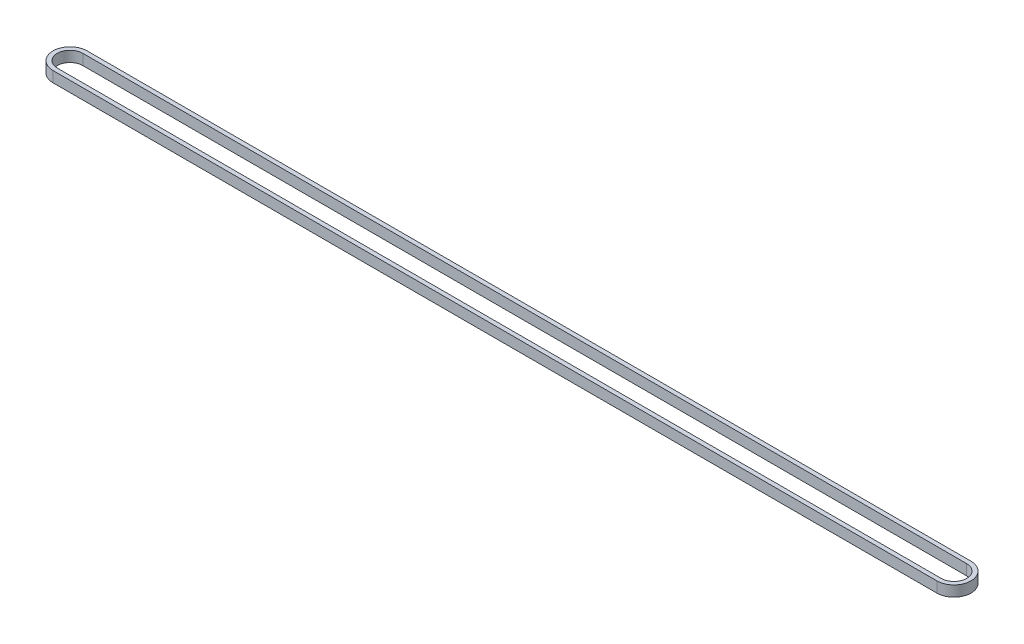
ISO-10303-21;
HEADER;
FILE_DESCRIPTION(('STEP AP214'),'2;1');
FILE_NAME('part.step','',(''),(''),'','','');
FILE_SCHEMA(('AUTOMOTIVE_DESIGN { 1 0 10303 214 1 1 1 1 }'));
ENDSEC;
DATA;
#1=APPLICATION_CONTEXT('core data for automotive mechanical design processes');
#2=APPLICATION_PROTOCOL_DEFINITION('international standard','automotive_design',2000,#1);
#3=PRODUCT_CONTEXT('',#1,'mechanical');
#4=PRODUCT('Part','Part','',(#3));
#5=PRODUCT_RELATED_PRODUCT_CATEGORY('part','',(#4));
#6=PRODUCT_DEFINITION_FORMATION('','',#4);
#7=PRODUCT_DEFINITION_CONTEXT('part definition',#1,'design');
#8=PRODUCT_DEFINITION('design','',#6,#7);
#9=PRODUCT_DEFINITION_SHAPE('','',#8);
#10=(LENGTH_UNIT() NAMED_UNIT(*) SI_UNIT(.MILLI.,.METRE.));
#11=(NAMED_UNIT(*) PLANE_ANGLE_UNIT() SI_UNIT($,.RADIAN.));
#12=(NAMED_UNIT(*) SI_UNIT($,.STERADIAN.) SOLID_ANGLE_UNIT());
#13=UNCERTAINTY_MEASURE_WITH_UNIT(LENGTH_MEASURE(1.E-05),#10,'distance_accuracy_value','');
#14=(GEOMETRIC_REPRESENTATION_CONTEXT(3) GLOBAL_UNCERTAINTY_ASSIGNED_CONTEXT((#13)) GLOBAL_UNIT_ASSIGNED_CONTEXT((#10,
#11,#12)) REPRESENTATION_CONTEXT('',''));
#15=CARTESIAN_POINT('',(0.,0.,0.));
#16=DIRECTION('',(0.,0.,1.));
#17=DIRECTION('',(1.,0.,0.));
#18=AXIS2_PLACEMENT_3D('',#15,#16,#17);
#19=CARTESIAN_POINT('',(39.267874125526,5.,-65.0224656768684));
#20=DIRECTION('',(0.,1.,0.));
#21=DIRECTION('',(0.,0.,1.));
#22=AXIS2_PLACEMENT_3D('',#19,#20,#21);
#23=PLANE('',#22);
#24=CARTESIAN_POINT('',(39.267874125526,5.,-65.0224656768684));
#25=DIRECTION('',(0.,1.,0.));
#26=DIRECTION('',(0.,0.,1.));
#27=AXIS2_PLACEMENT_3D('',#24,#25,#26);
#28=CIRCLE('',#27,8.);
#29=CARTESIAN_POINT('',(39.267874125526,5.,-73.0224656768684));
#30=VERTEX_POINT('',#29);
#31=CARTESIAN_POINT('',(39.267874125526,5.,-57.0224656768684));
#32=VERTEX_POINT('',#31);
#33=EDGE_CURVE('E152',#30,#32,#28,.T.);
#34=ORIENTED_EDGE('',*,*,#33,.T.);
#35=DIRECTION('',(1.,0.,0.));
#36=VECTOR('',#35,1.);
#37=CARTESIAN_POINT('',(39.267874125526,5.,-57.0224656768684));
#38=LINE('',#37,#36);
#39=CARTESIAN_POINT('',(454.267874125526,5.,-57.0224656768684));
#40=VERTEX_POINT('',#39);
#41=EDGE_CURVE('E156',#32,#40,#38,.T.);
#42=ORIENTED_EDGE('',*,*,#41,.T.);
#43=CARTESIAN_POINT('',(454.267874125526,5.,-65.0224656768684));
#44=DIRECTION('',(0.,1.,0.));
#45=DIRECTION('',(0.,0.,1.));
#46=AXIS2_PLACEMENT_3D('',#43,#44,#45);
#47=CIRCLE('',#46,8.);
#48=CARTESIAN_POINT('',(454.267874125526,5.,-73.0224656768684));
#49=VERTEX_POINT('',#48);
#50=EDGE_CURVE('E160',#40,#49,#47,.T.);
#51=ORIENTED_EDGE('',*,*,#50,.T.);
#52=DIRECTION('',(-1.,0.,0.));
#53=VECTOR('',#52,1.);
#54=CARTESIAN_POINT('',(39.267874125526,5.,-73.0224656768684));
#55=LINE('',#54,#53);
#56=EDGE_CURVE('E162',#49,#30,#55,.T.);
#57=ORIENTED_EDGE('',*,*,#56,.T.);
#58=EDGE_LOOP('',(#34,#42,#51,#57));
#59=FACE_BOUND('',#58,.T.);
#60=DIRECTION('',(1.,0.,0.));
#61=VECTOR('',#60,1.);
#62=CARTESIAN_POINT('',(39.267874125526,5.,-59.0224656768684));
#63=LINE('',#62,#61);
#64=CARTESIAN_POINT('',(39.267874125526,5.,-59.0224656768684));
#65=VERTEX_POINT('',#64);
#66=CARTESIAN_POINT('',(454.267874125526,5.,-59.0224656768684));
#67=VERTEX_POINT('',#66);
#68=EDGE_CURVE('E111',#65,#67,#63,.T.);
#69=ORIENTED_EDGE('',*,*,#68,.F.);
#70=CARTESIAN_POINT('',(39.267874125526,5.,-65.0224656768684));
#71=DIRECTION('',(0.,1.,0.));
#72=DIRECTION('',(0.,0.,1.));
#73=AXIS2_PLACEMENT_3D('',#70,#71,#72);
#74=CIRCLE('',#73,6.);
#75=CARTESIAN_POINT('',(39.267874125526,5.,-71.0224656768684));
#76=VERTEX_POINT('',#75);
#77=EDGE_CURVE('E102',#76,#65,#74,.T.);
#78=ORIENTED_EDGE('',*,*,#77,.F.);
#79=DIRECTION('',(-1.,0.,0.));
#80=VECTOR('',#79,1.);
#81=CARTESIAN_POINT('',(39.267874125526,5.,-71.0224656768684));
#82=LINE('',#81,#80);
#83=CARTESIAN_POINT('',(454.267874125526,5.,-71.0224656768684));
#84=VERTEX_POINT('',#83);
#85=EDGE_CURVE('E130',#84,#76,#82,.T.);
#86=ORIENTED_EDGE('',*,*,#85,.F.);
#87=CARTESIAN_POINT('',(454.267874125526,5.,-65.0224656768684));
#88=DIRECTION('',(0.,1.,0.));
#89=DIRECTION('',(0.,0.,1.));
#90=AXIS2_PLACEMENT_3D('',#87,#88,#89);
#91=CIRCLE('',#90,6.00000000000002);
#92=EDGE_CURVE('E124',#67,#84,#91,.T.);
#93=ORIENTED_EDGE('',*,*,#92,.F.);
#94=EDGE_LOOP('',(#69,#78,#86,#93));
#95=FACE_BOUND('',#94,.T.);
#96=ADVANCED_FACE('F36',(#59,#95),#23,.T.);
#97=CARTESIAN_POINT('',(39.267874125526,0.,-65.0224656768684));
#98=DIRECTION('',(0.,1.,0.));
#99=DIRECTION('',(0.,0.,1.));
#100=AXIS2_PLACEMENT_3D('',#97,#98,#99);
#101=PLANE('',#100);
#102=CARTESIAN_POINT('',(39.267874125526,0.,-65.0224656768684));
#103=DIRECTION('',(0.,1.,0.));
#104=DIRECTION('',(0.,0.,1.));
#105=AXIS2_PLACEMENT_3D('',#102,#103,#104);
#106=CIRCLE('',#105,8.);
#107=CARTESIAN_POINT('',(39.267874125526,0.,-73.0224656768684));
#108=VERTEX_POINT('',#107);
#109=CARTESIAN_POINT('',(39.267874125526,0.,-57.0224656768684));
#110=VERTEX_POINT('',#109);
#111=EDGE_CURVE('E120',#108,#110,#106,.T.);
#112=ORIENTED_EDGE('',*,*,#111,.F.);
#113=DIRECTION('',(-1.,0.,0.));
#114=VECTOR('',#113,1.);
#115=CARTESIAN_POINT('',(39.267874125526,0.,-73.0224656768684));
#116=LINE('',#115,#114);
#117=CARTESIAN_POINT('',(454.267874125526,0.,-73.0224656768684));
#118=VERTEX_POINT('',#117);
#119=EDGE_CURVE('E157',#118,#108,#116,.T.);
#120=ORIENTED_EDGE('',*,*,#119,.F.);
#121=CARTESIAN_POINT('',(454.267874125526,0.,-65.0224656768684));
#122=DIRECTION('',(0.,1.,0.));
#123=DIRECTION('',(0.,0.,1.));
#124=AXIS2_PLACEMENT_3D('',#121,#122,#123);
#125=CIRCLE('',#124,8.);
#126=CARTESIAN_POINT('',(454.267874125526,0.,-57.0224656768684));
#127=VERTEX_POINT('',#126);
#128=EDGE_CURVE('E172',#127,#118,#125,.T.);
#129=ORIENTED_EDGE('',*,*,#128,.F.);
#130=DIRECTION('',(1.,0.,0.));
#131=VECTOR('',#130,1.);
#132=CARTESIAN_POINT('',(39.267874125526,0.,-57.0224656768684));
#133=LINE('',#132,#131);
#134=EDGE_CURVE('E169',#110,#127,#133,.T.);
#135=ORIENTED_EDGE('',*,*,#134,.F.);
#136=EDGE_LOOP('',(#112,#120,#129,#135));
#137=FACE_BOUND('',#136,.T.);
#138=CARTESIAN_POINT('',(39.267874125526,0.,-65.0224656768684));
#139=DIRECTION('',(0.,1.,0.));
#140=DIRECTION('',(0.,0.,1.));
#141=AXIS2_PLACEMENT_3D('',#138,#139,#140);
#142=CIRCLE('',#141,6.);
#143=CARTESIAN_POINT('',(39.267874125526,0.,-71.0224656768684));
#144=VERTEX_POINT('',#143);
#145=CARTESIAN_POINT('',(39.267874125526,0.,-59.0224656768684));
#146=VERTEX_POINT('',#145);
#147=EDGE_CURVE('E60',#144,#146,#142,.T.);
#148=ORIENTED_EDGE('',*,*,#147,.T.);
#149=DIRECTION('',(1.,0.,0.));
#150=VECTOR('',#149,1.);
#151=CARTESIAN_POINT('',(39.267874125526,0.,-59.0224656768684));
#152=LINE('',#151,#150);
#153=CARTESIAN_POINT('',(454.267874125526,0.,-59.0224656768684));
#154=VERTEX_POINT('',#153);
#155=EDGE_CURVE('E118',#146,#154,#152,.T.);
#156=ORIENTED_EDGE('',*,*,#155,.T.);
#157=CARTESIAN_POINT('',(454.267874125526,0.,-65.0224656768684));
#158=DIRECTION('',(0.,1.,0.));
#159=DIRECTION('',(0.,0.,1.));
#160=AXIS2_PLACEMENT_3D('',#157,#158,#159);
#161=CIRCLE('',#160,6.00000000000002);
#162=CARTESIAN_POINT('',(454.267874125526,0.,-71.0224656768684));
#163=VERTEX_POINT('',#162);
#164=EDGE_CURVE('E139',#154,#163,#161,.T.);
#165=ORIENTED_EDGE('',*,*,#164,.T.);
#166=DIRECTION('',(-1.,0.,0.));
#167=VECTOR('',#166,1.);
#168=CARTESIAN_POINT('',(39.267874125526,0.,-71.0224656768684));
#169=LINE('',#168,#167);
#170=EDGE_CURVE('E112',#163,#144,#169,.T.);
#171=ORIENTED_EDGE('',*,*,#170,.T.);
#172=EDGE_LOOP('',(#148,#156,#165,#171));
#173=FACE_BOUND('',#172,.T.);
#174=ADVANCED_FACE('F194',(#137,#173),#101,.F.);
#175=CARTESIAN_POINT('',(39.267874125526,5.,-65.0224656768684));
#176=DIRECTION('',(0.,-1.,0.));
#177=DIRECTION('',(0.,0.,-1.));
#178=AXIS2_PLACEMENT_3D('',#175,#176,#177);
#179=CYLINDRICAL_SURFACE('',#178,8.);
#180=ORIENTED_EDGE('',*,*,#111,.T.);
#181=DIRECTION('',(0.,-1.,0.));
#182=VECTOR('',#181,1.);
#183=CARTESIAN_POINT('',(39.267874125526,5.,-57.0224656768684));
#184=LINE('',#183,#182);
#185=EDGE_CURVE('E11',#32,#110,#184,.T.);
#186=ORIENTED_EDGE('',*,*,#185,.F.);
#187=ORIENTED_EDGE('',*,*,#33,.F.);
#188=DIRECTION('',(0.,-1.,0.));
#189=VECTOR('',#188,1.);
#190=CARTESIAN_POINT('',(39.267874125526,5.,-73.0224656768684));
#191=LINE('',#190,#189);
#192=EDGE_CURVE('E165',#30,#108,#191,.T.);
#193=ORIENTED_EDGE('',*,*,#192,.T.);
#194=EDGE_LOOP('',(#180,#186,#187,#193));
#195=FACE_BOUND('',#194,.T.);
#196=ADVANCED_FACE('F38',(#195),#179,.T.);
#197=CARTESIAN_POINT('',(39.267874125526,5.,-57.0224656768684));
#198=DIRECTION('',(0.,0.,-1.));
#199=DIRECTION('',(-1.,0.,0.));
#200=AXIS2_PLACEMENT_3D('',#197,#198,#199);
#201=PLANE('',#200);
#202=ORIENTED_EDGE('',*,*,#134,.T.);
#203=DIRECTION('',(0.,-1.,0.));
#204=VECTOR('',#203,1.);
#205=CARTESIAN_POINT('',(454.267874125526,5.,-57.0224656768684));
#206=LINE('',#205,#204);
#207=EDGE_CURVE('E45',#40,#127,#206,.T.);
#208=ORIENTED_EDGE('',*,*,#207,.F.);
#209=ORIENTED_EDGE('',*,*,#41,.F.);
#210=ORIENTED_EDGE('',*,*,#185,.T.);
#211=EDGE_LOOP('',(#202,#208,#209,#210));
#212=FACE_BOUND('',#211,.T.);
#213=ADVANCED_FACE('F204',(#212),#201,.F.);
#214=CARTESIAN_POINT('',(454.267874125526,5.,-65.0224656768684));
#215=DIRECTION('',(0.,-1.,0.));
#216=DIRECTION('',(0.,0.,-1.));
#217=AXIS2_PLACEMENT_3D('',#214,#215,#216);
#218=CYLINDRICAL_SURFACE('',#217,8.);
#219=ORIENTED_EDGE('',*,*,#128,.T.);
#220=DIRECTION('',(0.,-1.,0.));
#221=VECTOR('',#220,1.);
#222=CARTESIAN_POINT('',(454.267874125526,5.,-73.0224656768684));
#223=LINE('',#222,#221);
#224=EDGE_CURVE('E180',#49,#118,#223,.T.);
#225=ORIENTED_EDGE('',*,*,#224,.F.);
#226=ORIENTED_EDGE('',*,*,#50,.F.);
#227=ORIENTED_EDGE('',*,*,#207,.T.);
#228=EDGE_LOOP('',(#219,#225,#226,#227));
#229=FACE_BOUND('',#228,.T.);
#230=ADVANCED_FACE('F188',(#229),#218,.T.);
#231=CARTESIAN_POINT('',(39.267874125526,5.,-73.0224656768684));
#232=DIRECTION('',(0.,0.,1.));
#233=DIRECTION('',(1.,0.,0.));
#234=AXIS2_PLACEMENT_3D('',#231,#232,#233);
#235=PLANE('',#234);
#236=ORIENTED_EDGE('',*,*,#119,.T.);
#237=ORIENTED_EDGE('',*,*,#192,.F.);
#238=ORIENTED_EDGE('',*,*,#56,.F.);
#239=ORIENTED_EDGE('',*,*,#224,.T.);
#240=EDGE_LOOP('',(#236,#237,#238,#239));
#241=FACE_BOUND('',#240,.T.);
#242=ADVANCED_FACE('F198',(#241),#235,.F.);
#243=CARTESIAN_POINT('',(39.267874125526,5.,-65.0224656768684));
#244=DIRECTION('',(0.,-1.,0.));
#245=DIRECTION('',(0.,0.,-1.));
#246=AXIS2_PLACEMENT_3D('',#243,#244,#245);
#247=CYLINDRICAL_SURFACE('',#246,6.);
#248=ORIENTED_EDGE('',*,*,#147,.F.);
#249=DIRECTION('',(0.,-1.,0.));
#250=VECTOR('',#249,1.);
#251=CARTESIAN_POINT('',(39.267874125526,5.,-71.0224656768684));
#252=LINE('',#251,#250);
#253=EDGE_CURVE('E106',#76,#144,#252,.T.);
#254=ORIENTED_EDGE('',*,*,#253,.F.);
#255=ORIENTED_EDGE('',*,*,#77,.T.);
#256=DIRECTION('',(0.,-1.,0.));
#257=VECTOR('',#256,1.);
#258=CARTESIAN_POINT('',(39.267874125526,5.,-59.0224656768684));
#259=LINE('',#258,#257);
#260=EDGE_CURVE('E105',#65,#146,#259,.T.);
#261=ORIENTED_EDGE('',*,*,#260,.T.);
#262=EDGE_LOOP('',(#248,#254,#255,#261));
#263=FACE_BOUND('',#262,.T.);
#264=ADVANCED_FACE('F104',(#263),#247,.F.);
#265=CARTESIAN_POINT('',(39.267874125526,5.,-59.0224656768684));
#266=DIRECTION('',(0.,0.,-1.));
#267=DIRECTION('',(-1.,0.,0.));
#268=AXIS2_PLACEMENT_3D('',#265,#266,#267);
#269=PLANE('',#268);
#270=ORIENTED_EDGE('',*,*,#155,.F.);
#271=ORIENTED_EDGE('',*,*,#260,.F.);
#272=ORIENTED_EDGE('',*,*,#68,.T.);
#273=DIRECTION('',(0.,-1.,0.));
#274=VECTOR('',#273,1.);
#275=CARTESIAN_POINT('',(454.267874125526,5.,-59.0224656768684));
#276=LINE('',#275,#274);
#277=EDGE_CURVE('E121',#67,#154,#276,.T.);
#278=ORIENTED_EDGE('',*,*,#277,.T.);
#279=EDGE_LOOP('',(#270,#271,#272,#278));
#280=FACE_BOUND('',#279,.T.);
#281=ADVANCED_FACE('F115',(#280),#269,.T.);
#282=CARTESIAN_POINT('',(454.267874125526,5.,-65.0224656768684));
#283=DIRECTION('',(0.,-1.,0.));
#284=DIRECTION('',(0.,0.,-1.));
#285=AXIS2_PLACEMENT_3D('',#282,#283,#284);
#286=CYLINDRICAL_SURFACE('',#285,6.00000000000002);
#287=ORIENTED_EDGE('',*,*,#164,.F.);
#288=ORIENTED_EDGE('',*,*,#277,.F.);
#289=ORIENTED_EDGE('',*,*,#92,.T.);
#290=DIRECTION('',(0.,-1.,0.));
#291=VECTOR('',#290,1.);
#292=CARTESIAN_POINT('',(454.267874125526,5.,-71.0224656768684));
#293=LINE('',#292,#291);
#294=EDGE_CURVE('E52',#84,#163,#293,.T.);
#295=ORIENTED_EDGE('',*,*,#294,.T.);
#296=EDGE_LOOP('',(#287,#288,#289,#295));
#297=FACE_BOUND('',#296,.T.);
#298=ADVANCED_FACE('F227',(#297),#286,.F.);
#299=CARTESIAN_POINT('',(39.267874125526,5.,-71.0224656768684));
#300=DIRECTION('',(0.,0.,1.));
#301=DIRECTION('',(1.,0.,0.));
#302=AXIS2_PLACEMENT_3D('',#299,#300,#301);
#303=PLANE('',#302);
#304=ORIENTED_EDGE('',*,*,#170,.F.);
#305=ORIENTED_EDGE('',*,*,#294,.F.);
#306=ORIENTED_EDGE('',*,*,#85,.T.);
#307=ORIENTED_EDGE('',*,*,#253,.T.);
#308=EDGE_LOOP('',(#304,#305,#306,#307));
#309=FACE_BOUND('',#308,.T.);
#310=ADVANCED_FACE('F231',(#309),#303,.T.);
#311=CLOSED_SHELL('',(#96,#174,#196,#213,#230,#242,#264,#281,#298,#310));
#312=MANIFOLD_SOLID_BREP('B2',#311);
#313=ADVANCED_BREP_SHAPE_REPRESENTATION('',(#18,#312),#14);
#314=SHAPE_DEFINITION_REPRESENTATION(#9,#313);
ENDSEC;
END-ISO-10303-21;
